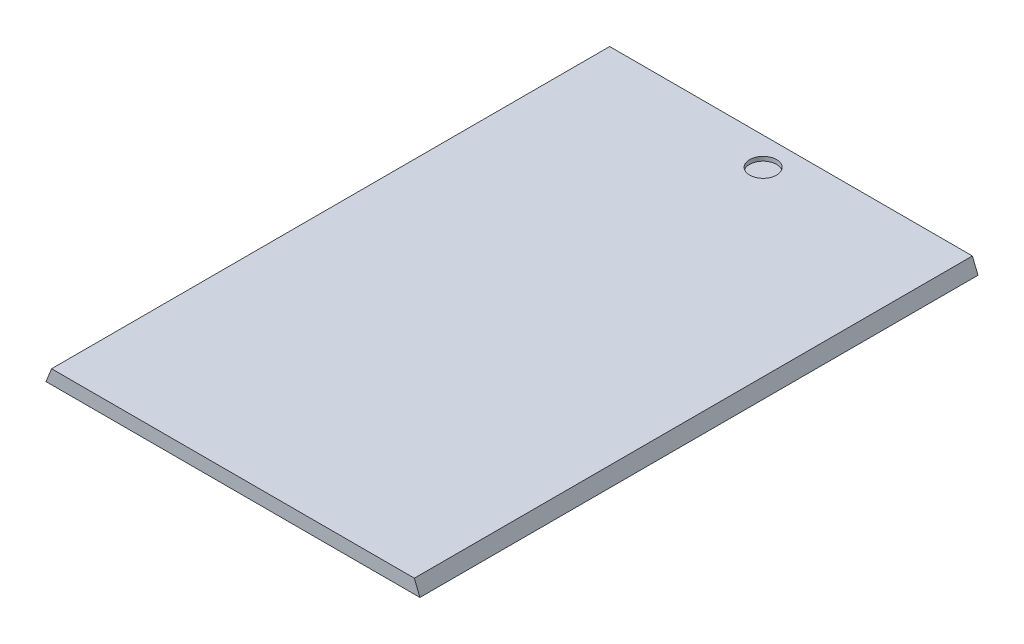
ISO-10303-21;
HEADER;
FILE_DESCRIPTION(('STEP AP214'),'2;1');
FILE_NAME('part.step','',(''),(''),'','','');
FILE_SCHEMA(('AUTOMOTIVE_DESIGN { 1 0 10303 214 1 1 1 1 }'));
ENDSEC;
DATA;
#1=APPLICATION_CONTEXT('core data for automotive mechanical design processes');
#2=APPLICATION_PROTOCOL_DEFINITION('international standard','automotive_design',2000,#1);
#3=PRODUCT_CONTEXT('',#1,'mechanical');
#4=PRODUCT('Part','Part','',(#3));
#5=PRODUCT_RELATED_PRODUCT_CATEGORY('part','',(#4));
#6=PRODUCT_DEFINITION_FORMATION('','',#4);
#7=PRODUCT_DEFINITION_CONTEXT('part definition',#1,'design');
#8=PRODUCT_DEFINITION('design','',#6,#7);
#9=PRODUCT_DEFINITION_SHAPE('','',#8);
#10=(LENGTH_UNIT() NAMED_UNIT(*) SI_UNIT(.MILLI.,.METRE.));
#11=(NAMED_UNIT(*) PLANE_ANGLE_UNIT() SI_UNIT($,.RADIAN.));
#12=(NAMED_UNIT(*) SI_UNIT($,.STERADIAN.) SOLID_ANGLE_UNIT());
#13=UNCERTAINTY_MEASURE_WITH_UNIT(LENGTH_MEASURE(1.E-05),#10,'distance_accuracy_value','');
#14=(GEOMETRIC_REPRESENTATION_CONTEXT(3) GLOBAL_UNCERTAINTY_ASSIGNED_CONTEXT((#13)) GLOBAL_UNIT_ASSIGNED_CONTEXT((#10,
#11,#12)) REPRESENTATION_CONTEXT('',''));
#15=CARTESIAN_POINT('',(0.,0.,0.));
#16=DIRECTION('',(0.,0.,1.));
#17=DIRECTION('',(1.,0.,0.));
#18=AXIS2_PLACEMENT_3D('',#15,#16,#17);
#19=CARTESIAN_POINT('',(-108.5,23.3021806853582,200.));
#20=DIRECTION('',(0.928476690885259,-0.371390676354104,0.));
#21=DIRECTION('',(0.371390676354104,0.928476690885259,0.));
#22=AXIS2_PLACEMENT_3D('',#19,#20,#21);
#23=PLANE('',#22);
#24=DIRECTION('',(-0.371390676354104,-0.928476690885259,0.));
#25=VECTOR('',#24,1.);
#26=CARTESIAN_POINT('',(-108.5,23.3021806853582,0.));
#27=LINE('',#26,#25);
#28=CARTESIAN_POINT('',(-106.5,28.3021806853582,0.));
#29=VERTEX_POINT('',#28);
#30=CARTESIAN_POINT('',(-108.5,23.3021806853582,0.));
#31=VERTEX_POINT('',#30);
#32=EDGE_CURVE('E107',#29,#31,#27,.T.);
#33=ORIENTED_EDGE('',*,*,#32,.T.);
#34=DIRECTION('',(0.,0.,-1.));
#35=VECTOR('',#34,1.);
#36=CARTESIAN_POINT('',(-108.5,23.3021806853582,200.));
#37=LINE('',#36,#35);
#38=CARTESIAN_POINT('',(-108.5,23.3021806853582,200.));
#39=VERTEX_POINT('',#38);
#40=EDGE_CURVE('E11',#39,#31,#37,.T.);
#41=ORIENTED_EDGE('',*,*,#40,.F.);
#42=DIRECTION('',(-0.371390676354104,-0.928476690885259,0.));
#43=VECTOR('',#42,1.);
#44=CARTESIAN_POINT('',(-108.5,23.3021806853582,200.));
#45=LINE('',#44,#43);
#46=CARTESIAN_POINT('',(-106.5,28.3021806853582,200.));
#47=VERTEX_POINT('',#46);
#48=EDGE_CURVE('E91',#47,#39,#45,.T.);
#49=ORIENTED_EDGE('',*,*,#48,.F.);
#50=DIRECTION('',(0.,0.,-1.));
#51=VECTOR('',#50,1.);
#52=CARTESIAN_POINT('',(-106.5,28.3021806853582,200.));
#53=LINE('',#52,#51);
#54=EDGE_CURVE('E103',#47,#29,#53,.T.);
#55=ORIENTED_EDGE('',*,*,#54,.T.);
#56=EDGE_LOOP('',(#33,#41,#49,#55));
#57=FACE_BOUND('',#56,.T.);
#58=ADVANCED_FACE('F39',(#57),#23,.F.);
#59=CARTESIAN_POINT('',(-108.5,23.3021806853582,200.));
#60=DIRECTION('',(0.,1.,0.));
#61=DIRECTION('',(0.,0.,1.));
#62=AXIS2_PLACEMENT_3D('',#59,#60,#61);
#63=PLANE('',#62);
#64=DIRECTION('',(1.,0.,0.));
#65=VECTOR('',#64,1.);
#66=CARTESIAN_POINT('',(-108.5,23.3021806853582,0.));
#67=LINE('',#66,#65);
#68=CARTESIAN_POINT('',(25.5,23.3021806853582,0.));
#69=VERTEX_POINT('',#68);
#70=EDGE_CURVE('E96',#31,#69,#67,.T.);
#71=ORIENTED_EDGE('',*,*,#70,.T.);
#72=DIRECTION('',(0.,0.,-1.));
#73=VECTOR('',#72,1.);
#74=CARTESIAN_POINT('',(25.5,23.3021806853582,200.));
#75=LINE('',#74,#73);
#76=CARTESIAN_POINT('',(25.5,23.3021806853582,200.));
#77=VERTEX_POINT('',#76);
#78=EDGE_CURVE('E48',#77,#69,#75,.T.);
#79=ORIENTED_EDGE('',*,*,#78,.F.);
#80=DIRECTION('',(1.,0.,0.));
#81=VECTOR('',#80,1.);
#82=CARTESIAN_POINT('',(-108.5,23.3021806853582,200.));
#83=LINE('',#82,#81);
#84=EDGE_CURVE('E86',#39,#77,#83,.T.);
#85=ORIENTED_EDGE('',*,*,#84,.F.);
#86=ORIENTED_EDGE('',*,*,#40,.T.);
#87=EDGE_LOOP('',(#71,#79,#85,#86));
#88=FACE_BOUND('',#87,.T.);
#89=ADVANCED_FACE('F95',(#88),#63,.F.);
#90=CARTESIAN_POINT('',(23.5,28.3021806853582,200.));
#91=DIRECTION('',(-0.928476690885259,-0.371390676354104,0.));
#92=DIRECTION('',(0.371390676354104,-0.928476690885259,0.));
#93=AXIS2_PLACEMENT_3D('',#90,#91,#92);
#94=PLANE('',#93);
#95=DIRECTION('',(-0.371390676354104,0.928476690885259,0.));
#96=VECTOR('',#95,1.);
#97=CARTESIAN_POINT('',(23.5,28.3021806853582,0.));
#98=LINE('',#97,#96);
#99=CARTESIAN_POINT('',(23.5,28.3021806853582,0.));
#100=VERTEX_POINT('',#99);
#101=EDGE_CURVE('E73',#69,#100,#98,.T.);
#102=ORIENTED_EDGE('',*,*,#101,.T.);
#103=DIRECTION('',(0.,0.,-1.));
#104=VECTOR('',#103,1.);
#105=CARTESIAN_POINT('',(23.5,28.3021806853582,200.));
#106=LINE('',#105,#104);
#107=CARTESIAN_POINT('',(23.5,28.3021806853582,200.));
#108=VERTEX_POINT('',#107);
#109=EDGE_CURVE('E98',#108,#100,#106,.T.);
#110=ORIENTED_EDGE('',*,*,#109,.F.);
#111=DIRECTION('',(-0.371390676354104,0.928476690885259,0.));
#112=VECTOR('',#111,1.);
#113=CARTESIAN_POINT('',(23.5,28.3021806853582,200.));
#114=LINE('',#113,#112);
#115=EDGE_CURVE('E89',#77,#108,#114,.T.);
#116=ORIENTED_EDGE('',*,*,#115,.F.);
#117=ORIENTED_EDGE('',*,*,#78,.T.);
#118=EDGE_LOOP('',(#102,#110,#116,#117));
#119=FACE_BOUND('',#118,.T.);
#120=ADVANCED_FACE('F99',(#119),#94,.F.);
#121=CARTESIAN_POINT('',(-106.5,28.3021806853582,200.));
#122=DIRECTION('',(0.,-1.,0.));
#123=DIRECTION('',(0.,0.,-1.));
#124=AXIS2_PLACEMENT_3D('',#121,#122,#123);
#125=PLANE('',#124);
#126=CARTESIAN_POINT('',(-41.5,28.3021806853582,10.));
#127=DIRECTION('',(0.,1.,0.));
#128=DIRECTION('',(0.,0.,1.));
#129=AXIS2_PLACEMENT_3D('',#126,#127,#128);
#130=CIRCLE('',#129,4.82822657108311);
#131=CARTESIAN_POINT('',(-41.5,28.3021806853582,14.8282265710831));
#132=VERTEX_POINT('',#131);
#133=EDGE_CURVE('E128',#132,#132,#130,.T.);
#134=ORIENTED_EDGE('',*,*,#133,.F.);
#135=EDGE_LOOP('',(#134));
#136=FACE_BOUND('',#135,.T.);
#137=DIRECTION('',(-1.,0.,0.));
#138=VECTOR('',#137,1.);
#139=CARTESIAN_POINT('',(-106.5,28.3021806853582,0.));
#140=LINE('',#139,#138);
#141=EDGE_CURVE('E79',#100,#29,#140,.T.);
#142=ORIENTED_EDGE('',*,*,#141,.T.);
#143=ORIENTED_EDGE('',*,*,#54,.F.);
#144=DIRECTION('',(-1.,0.,0.));
#145=VECTOR('',#144,1.);
#146=CARTESIAN_POINT('',(-106.5,28.3021806853582,200.));
#147=LINE('',#146,#145);
#148=EDGE_CURVE('E56',#108,#47,#147,.T.);
#149=ORIENTED_EDGE('',*,*,#148,.F.);
#150=ORIENTED_EDGE('',*,*,#109,.T.);
#151=EDGE_LOOP('',(#142,#143,#149,#150));
#152=FACE_BOUND('',#151,.T.);
#153=ADVANCED_FACE('F121',(#136,#152),#125,.F.);
#154=CARTESIAN_POINT('',(0.,0.,200.));
#155=DIRECTION('',(0.,0.,-1.));
#156=DIRECTION('',(-1.,0.,0.));
#157=AXIS2_PLACEMENT_3D('',#154,#155,#156);
#158=PLANE('',#157);
#159=ORIENTED_EDGE('',*,*,#48,.T.);
#160=ORIENTED_EDGE('',*,*,#84,.T.);
#161=ORIENTED_EDGE('',*,*,#115,.T.);
#162=ORIENTED_EDGE('',*,*,#148,.T.);
#163=EDGE_LOOP('',(#159,#160,#161,#162));
#164=FACE_BOUND('',#163,.T.);
#165=ADVANCED_FACE('F87',(#164),#158,.F.);
#166=CARTESIAN_POINT('',(0.,0.,0.));
#167=DIRECTION('',(0.,0.,-1.));
#168=DIRECTION('',(-1.,0.,0.));
#169=AXIS2_PLACEMENT_3D('',#166,#167,#168);
#170=PLANE('',#169);
#171=ORIENTED_EDGE('',*,*,#32,.F.);
#172=ORIENTED_EDGE('',*,*,#141,.F.);
#173=ORIENTED_EDGE('',*,*,#101,.F.);
#174=ORIENTED_EDGE('',*,*,#70,.F.);
#175=EDGE_LOOP('',(#171,#172,#173,#174));
#176=FACE_BOUND('',#175,.T.);
#177=ADVANCED_FACE('F124',(#176),#170,.T.);
#178=CARTESIAN_POINT('',(-41.5,26.8021806853582,10.));
#179=DIRECTION('',(0.,1.,0.));
#180=DIRECTION('',(0.,0.,1.));
#181=AXIS2_PLACEMENT_3D('',#178,#179,#180);
#182=CYLINDRICAL_SURFACE('',#181,4.82822657108311);
#183=CARTESIAN_POINT('',(-41.5,26.8021806853582,10.));
#184=DIRECTION('',(0.,1.,0.));
#185=DIRECTION('',(0.,0.,1.));
#186=AXIS2_PLACEMENT_3D('',#183,#184,#185);
#187=CIRCLE('',#186,4.82822657108311);
#188=CARTESIAN_POINT('',(-41.5,26.8021806853582,14.8282265710831));
#189=VERTEX_POINT('',#188);
#190=EDGE_CURVE('E111',#189,#189,#187,.T.);
#191=ORIENTED_EDGE('',*,*,#190,.F.);
#192=EDGE_LOOP('',(#191));
#193=FACE_BOUND('',#192,.T.);
#194=ORIENTED_EDGE('',*,*,#133,.T.);
#195=EDGE_LOOP('',(#194));
#196=FACE_BOUND('',#195,.T.);
#197=ADVANCED_FACE('F138',(#193,#196),#182,.F.);
#198=CARTESIAN_POINT('',(-41.5,26.8021806853582,10.));
#199=DIRECTION('',(0.,1.,0.));
#200=DIRECTION('',(0.,0.,1.));
#201=AXIS2_PLACEMENT_3D('',#198,#199,#200);
#202=PLANE('',#201);
#203=ORIENTED_EDGE('',*,*,#190,.T.);
#204=EDGE_LOOP('',(#203));
#205=FACE_BOUND('',#204,.T.);
#206=ADVANCED_FACE('F136',(#205),#202,.T.);
#207=CLOSED_SHELL('',(#58,#89,#120,#153,#165,#177,#197,#206));
#208=MANIFOLD_SOLID_BREP('B2',#207);
#209=ADVANCED_BREP_SHAPE_REPRESENTATION('',(#18,#208),#14);
#210=SHAPE_DEFINITION_REPRESENTATION(#9,#209);
ENDSEC;
END-ISO-10303-21;
